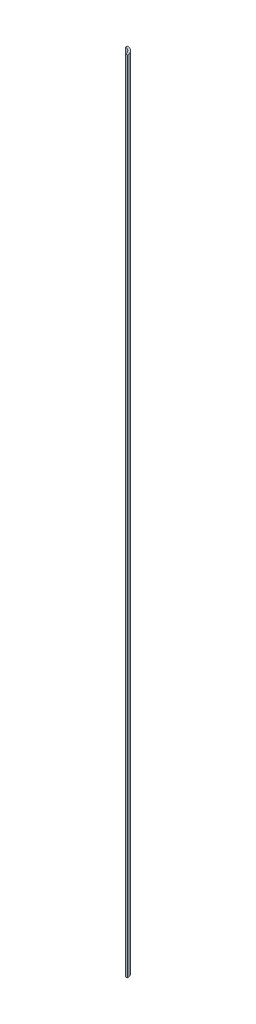
ISO-10303-21;
HEADER;
FILE_DESCRIPTION(('STEP AP214'),'2;1');
FILE_NAME('part.step','',(''),(''),'','','');
FILE_SCHEMA(('AUTOMOTIVE_DESIGN { 1 0 10303 214 1 1 1 1 }'));
ENDSEC;
DATA;
#1=APPLICATION_CONTEXT('core data for automotive mechanical design processes');
#2=APPLICATION_PROTOCOL_DEFINITION('international standard','automotive_design',2000,#1);
#3=PRODUCT_CONTEXT('',#1,'mechanical');
#4=PRODUCT('Part','Part','',(#3));
#5=PRODUCT_RELATED_PRODUCT_CATEGORY('part','',(#4));
#6=PRODUCT_DEFINITION_FORMATION('','',#4);
#7=PRODUCT_DEFINITION_CONTEXT('part definition',#1,'design');
#8=PRODUCT_DEFINITION('design','',#6,#7);
#9=PRODUCT_DEFINITION_SHAPE('','',#8);
#10=(LENGTH_UNIT() NAMED_UNIT(*) SI_UNIT(.MILLI.,.METRE.));
#11=(NAMED_UNIT(*) PLANE_ANGLE_UNIT() SI_UNIT($,.RADIAN.));
#12=(NAMED_UNIT(*) SI_UNIT($,.STERADIAN.) SOLID_ANGLE_UNIT());
#13=UNCERTAINTY_MEASURE_WITH_UNIT(LENGTH_MEASURE(1.E-05),#10,'distance_accuracy_value','');
#14=(GEOMETRIC_REPRESENTATION_CONTEXT(3) GLOBAL_UNCERTAINTY_ASSIGNED_CONTEXT((#13)) GLOBAL_UNIT_ASSIGNED_CONTEXT((#10,
#11,#12)) REPRESENTATION_CONTEXT('',''));
#15=CARTESIAN_POINT('',(0.,0.,0.));
#16=DIRECTION('',(0.,0.,1.));
#17=DIRECTION('',(1.,0.,0.));
#18=AXIS2_PLACEMENT_3D('',#15,#16,#17);
#19=CARTESIAN_POINT('',(0.,203.,0.));
#20=DIRECTION('',(0.,-1.,0.));
#21=DIRECTION('',(0.,0.,-1.));
#22=AXIS2_PLACEMENT_3D('',#19,#20,#21);
#23=CYLINDRICAL_SURFACE('',#22,1.5);
#24=CARTESIAN_POINT('',(0.,0.,0.));
#25=DIRECTION('',(0.,-1.,0.));
#26=DIRECTION('',(0.,0.,1.));
#27=AXIS2_PLACEMENT_3D('',#24,#25,#26);
#28=CIRCLE('',#27,1.5);
#29=CARTESIAN_POINT('',(0.,0.,-1.5));
#30=VERTEX_POINT('',#29);
#31=CARTESIAN_POINT('',(1.5,0.,0.));
#32=VERTEX_POINT('',#31);
#33=EDGE_CURVE('E107',#30,#32,#28,.T.);
#34=ORIENTED_EDGE('',*,*,#33,.T.);
#35=DIRECTION('',(0.,-1.,0.));
#36=VECTOR('',#35,1.);
#37=CARTESIAN_POINT('',(1.5,203.,0.));
#38=LINE('',#37,#36);
#39=CARTESIAN_POINT('',(1.5,203.,0.));
#40=VERTEX_POINT('',#39);
#41=EDGE_CURVE('E11',#40,#32,#38,.T.);
#42=ORIENTED_EDGE('',*,*,#41,.F.);
#43=CARTESIAN_POINT('',(0.,203.,0.));
#44=DIRECTION('',(0.,-1.,0.));
#45=DIRECTION('',(0.,0.,1.));
#46=AXIS2_PLACEMENT_3D('',#43,#44,#45);
#47=CIRCLE('',#46,1.5);
#48=CARTESIAN_POINT('',(0.,203.,-1.5));
#49=VERTEX_POINT('',#48);
#50=EDGE_CURVE('E91',#49,#40,#47,.T.);
#51=ORIENTED_EDGE('',*,*,#50,.F.);
#52=DIRECTION('',(0.,-1.,0.));
#53=VECTOR('',#52,1.);
#54=CARTESIAN_POINT('',(0.,203.,-1.5));
#55=LINE('',#54,#53);
#56=EDGE_CURVE('E103',#49,#30,#55,.T.);
#57=ORIENTED_EDGE('',*,*,#56,.T.);
#58=EDGE_LOOP('',(#34,#42,#51,#57));
#59=FACE_BOUND('',#58,.T.);
#60=ADVANCED_FACE('F39',(#59),#23,.F.);
#61=CARTESIAN_POINT('',(1.5,203.,0.));
#62=DIRECTION('',(0.,0.,-1.));
#63=DIRECTION('',(-1.,0.,0.));
#64=AXIS2_PLACEMENT_3D('',#61,#62,#63);
#65=PLANE('',#64);
#66=DIRECTION('',(1.,0.,0.));
#67=VECTOR('',#66,1.);
#68=CARTESIAN_POINT('',(1.5,0.,0.));
#69=LINE('',#68,#67);
#70=CARTESIAN_POINT('',(2.,0.,0.));
#71=VERTEX_POINT('',#70);
#72=EDGE_CURVE('E96',#32,#71,#69,.T.);
#73=ORIENTED_EDGE('',*,*,#72,.T.);
#74=DIRECTION('',(0.,-1.,0.));
#75=VECTOR('',#74,1.);
#76=CARTESIAN_POINT('',(2.,203.,0.));
#77=LINE('',#76,#75);
#78=CARTESIAN_POINT('',(2.,203.,0.));
#79=VERTEX_POINT('',#78);
#80=EDGE_CURVE('E48',#79,#71,#77,.T.);
#81=ORIENTED_EDGE('',*,*,#80,.F.);
#82=DIRECTION('',(1.,0.,0.));
#83=VECTOR('',#82,1.);
#84=CARTESIAN_POINT('',(1.5,203.,0.));
#85=LINE('',#84,#83);
#86=EDGE_CURVE('E86',#40,#79,#85,.T.);
#87=ORIENTED_EDGE('',*,*,#86,.F.);
#88=ORIENTED_EDGE('',*,*,#41,.T.);
#89=EDGE_LOOP('',(#73,#81,#87,#88));
#90=FACE_BOUND('',#89,.T.);
#91=ADVANCED_FACE('F95',(#90),#65,.F.);
#92=CARTESIAN_POINT('',(0.,203.,0.));
#93=DIRECTION('',(0.,-1.,0.));
#94=DIRECTION('',(0.,0.,-1.));
#95=AXIS2_PLACEMENT_3D('',#92,#93,#94);
#96=CYLINDRICAL_SURFACE('',#95,2.);
#97=CARTESIAN_POINT('',(0.,0.,0.));
#98=DIRECTION('',(0.,1.,0.));
#99=DIRECTION('',(0.,0.,1.));
#100=AXIS2_PLACEMENT_3D('',#97,#98,#99);
#101=CIRCLE('',#100,2.);
#102=CARTESIAN_POINT('',(0.,0.,-2.));
#103=VERTEX_POINT('',#102);
#104=EDGE_CURVE('E73',#71,#103,#101,.T.);
#105=ORIENTED_EDGE('',*,*,#104,.T.);
#106=DIRECTION('',(0.,-1.,0.));
#107=VECTOR('',#106,1.);
#108=CARTESIAN_POINT('',(0.,203.,-2.));
#109=LINE('',#108,#107);
#110=CARTESIAN_POINT('',(0.,203.,-2.));
#111=VERTEX_POINT('',#110);
#112=EDGE_CURVE('E98',#111,#103,#109,.T.);
#113=ORIENTED_EDGE('',*,*,#112,.F.);
#114=CARTESIAN_POINT('',(0.,203.,0.));
#115=DIRECTION('',(0.,1.,0.));
#116=DIRECTION('',(0.,0.,1.));
#117=AXIS2_PLACEMENT_3D('',#114,#115,#116);
#118=CIRCLE('',#117,2.);
#119=EDGE_CURVE('E89',#79,#111,#118,.T.);
#120=ORIENTED_EDGE('',*,*,#119,.F.);
#121=ORIENTED_EDGE('',*,*,#80,.T.);
#122=EDGE_LOOP('',(#105,#113,#120,#121));
#123=FACE_BOUND('',#122,.T.);
#124=ADVANCED_FACE('F99',(#123),#96,.T.);
#125=CARTESIAN_POINT('',(0.,203.,-2.));
#126=DIRECTION('',(1.,0.,0.));
#127=DIRECTION('',(0.,0.,-1.));
#128=AXIS2_PLACEMENT_3D('',#125,#126,#127);
#129=PLANE('',#128);
#130=DIRECTION('',(0.,0.,1.));
#131=VECTOR('',#130,1.);
#132=CARTESIAN_POINT('',(0.,0.,-2.));
#133=LINE('',#132,#131);
#134=EDGE_CURVE('E79',#103,#30,#133,.T.);
#135=ORIENTED_EDGE('',*,*,#134,.T.);
#136=ORIENTED_EDGE('',*,*,#56,.F.);
#137=DIRECTION('',(0.,0.,1.));
#138=VECTOR('',#137,1.);
#139=CARTESIAN_POINT('',(0.,203.,-2.));
#140=LINE('',#139,#138);
#141=EDGE_CURVE('E56',#111,#49,#140,.T.);
#142=ORIENTED_EDGE('',*,*,#141,.F.);
#143=ORIENTED_EDGE('',*,*,#112,.T.);
#144=EDGE_LOOP('',(#135,#136,#142,#143));
#145=FACE_BOUND('',#144,.T.);
#146=ADVANCED_FACE('F120',(#145),#129,.F.);
#147=CARTESIAN_POINT('',(0.,203.,0.));
#148=DIRECTION('',(0.,1.,0.));
#149=DIRECTION('',(0.,0.,1.));
#150=AXIS2_PLACEMENT_3D('',#147,#148,#149);
#151=PLANE('',#150);
#152=ORIENTED_EDGE('',*,*,#50,.T.);
#153=ORIENTED_EDGE('',*,*,#86,.T.);
#154=ORIENTED_EDGE('',*,*,#119,.T.);
#155=ORIENTED_EDGE('',*,*,#141,.T.);
#156=EDGE_LOOP('',(#152,#153,#154,#155));
#157=FACE_BOUND('',#156,.T.);
#158=ADVANCED_FACE('F87',(#157),#151,.T.);
#159=CARTESIAN_POINT('',(0.,0.,0.));
#160=DIRECTION('',(0.,1.,0.));
#161=DIRECTION('',(0.,0.,1.));
#162=AXIS2_PLACEMENT_3D('',#159,#160,#161);
#163=PLANE('',#162);
#164=ORIENTED_EDGE('',*,*,#33,.F.);
#165=ORIENTED_EDGE('',*,*,#134,.F.);
#166=ORIENTED_EDGE('',*,*,#104,.F.);
#167=ORIENTED_EDGE('',*,*,#72,.F.);
#168=EDGE_LOOP('',(#164,#165,#166,#167));
#169=FACE_BOUND('',#168,.T.);
#170=ADVANCED_FACE('F123',(#169),#163,.F.);
#171=CLOSED_SHELL('',(#60,#91,#124,#146,#158,#170));
#172=MANIFOLD_SOLID_BREP('B2',#171);
#173=ADVANCED_BREP_SHAPE_REPRESENTATION('',(#18,#172),#14);
#174=SHAPE_DEFINITION_REPRESENTATION(#9,#173);
ENDSEC;
END-ISO-10303-21;
